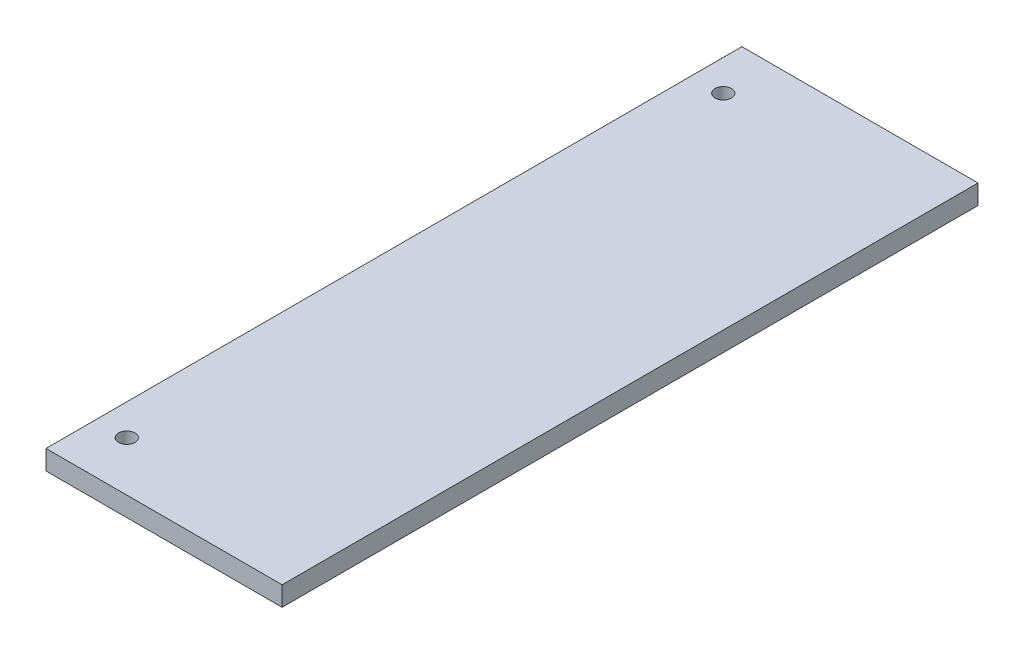
ISO-10303-21;
HEADER;
FILE_DESCRIPTION(('STEP AP214'),'2;1');
FILE_NAME('part.step','',(''),(''),'','','');
FILE_SCHEMA(('AUTOMOTIVE_DESIGN { 1 0 10303 214 1 1 1 1 }'));
ENDSEC;
DATA;
#1=APPLICATION_CONTEXT('core data for automotive mechanical design processes');
#2=APPLICATION_PROTOCOL_DEFINITION('international standard','automotive_design',2000,#1);
#3=PRODUCT_CONTEXT('',#1,'mechanical');
#4=PRODUCT('Part','Part','',(#3));
#5=PRODUCT_RELATED_PRODUCT_CATEGORY('part','',(#4));
#6=PRODUCT_DEFINITION_FORMATION('','',#4);
#7=PRODUCT_DEFINITION_CONTEXT('part definition',#1,'design');
#8=PRODUCT_DEFINITION('design','',#6,#7);
#9=PRODUCT_DEFINITION_SHAPE('','',#8);
#10=(LENGTH_UNIT() NAMED_UNIT(*) SI_UNIT(.MILLI.,.METRE.));
#11=(NAMED_UNIT(*) PLANE_ANGLE_UNIT() SI_UNIT($,.RADIAN.));
#12=(NAMED_UNIT(*) SI_UNIT($,.STERADIAN.) SOLID_ANGLE_UNIT());
#13=UNCERTAINTY_MEASURE_WITH_UNIT(LENGTH_MEASURE(1.E-05),#10,'distance_accuracy_value','');
#14=(GEOMETRIC_REPRESENTATION_CONTEXT(3) GLOBAL_UNCERTAINTY_ASSIGNED_CONTEXT((#13)) GLOBAL_UNIT_ASSIGNED_CONTEXT((#10,
#11,#12)) REPRESENTATION_CONTEXT('',''));
#15=CARTESIAN_POINT('',(0.,0.,0.));
#16=DIRECTION('',(0.,0.,1.));
#17=DIRECTION('',(1.,0.,0.));
#18=AXIS2_PLACEMENT_3D('',#15,#16,#17);
#19=CARTESIAN_POINT('',(15.08125,2.5,44.45));
#20=DIRECTION('',(-1.,0.,0.));
#21=DIRECTION('',(0.,0.,1.));
#22=AXIS2_PLACEMENT_3D('',#19,#20,#21);
#23=PLANE('',#22);
#24=DIRECTION('',(0.,0.,-1.));
#25=VECTOR('',#24,1.);
#26=CARTESIAN_POINT('',(15.08125,0.,44.45));
#27=LINE('',#26,#25);
#28=CARTESIAN_POINT('',(15.08125,0.,44.45));
#29=VERTEX_POINT('',#28);
#30=CARTESIAN_POINT('',(15.08125,0.,-44.45));
#31=VERTEX_POINT('',#30);
#32=EDGE_CURVE('E107',#29,#31,#27,.T.);
#33=ORIENTED_EDGE('',*,*,#32,.T.);
#34=DIRECTION('',(0.,-1.,0.));
#35=VECTOR('',#34,1.);
#36=CARTESIAN_POINT('',(15.08125,2.5,-44.45));
#37=LINE('',#36,#35);
#38=CARTESIAN_POINT('',(15.08125,2.5,-44.45));
#39=VERTEX_POINT('',#38);
#40=EDGE_CURVE('E11',#39,#31,#37,.T.);
#41=ORIENTED_EDGE('',*,*,#40,.F.);
#42=DIRECTION('',(0.,0.,-1.));
#43=VECTOR('',#42,1.);
#44=CARTESIAN_POINT('',(15.08125,2.5,44.45));
#45=LINE('',#44,#43);
#46=CARTESIAN_POINT('',(15.08125,2.5,44.45));
#47=VERTEX_POINT('',#46);
#48=EDGE_CURVE('E91',#47,#39,#45,.T.);
#49=ORIENTED_EDGE('',*,*,#48,.F.);
#50=DIRECTION('',(0.,-1.,0.));
#51=VECTOR('',#50,1.);
#52=CARTESIAN_POINT('',(15.08125,2.5,44.45));
#53=LINE('',#52,#51);
#54=EDGE_CURVE('E103',#47,#29,#53,.T.);
#55=ORIENTED_EDGE('',*,*,#54,.T.);
#56=EDGE_LOOP('',(#33,#41,#49,#55));
#57=FACE_BOUND('',#56,.T.);
#58=ADVANCED_FACE('F39',(#57),#23,.F.);
#59=CARTESIAN_POINT('',(-15.08125,2.5,-44.45));
#60=DIRECTION('',(0.,0.,1.));
#61=DIRECTION('',(1.,0.,0.));
#62=AXIS2_PLACEMENT_3D('',#59,#60,#61);
#63=PLANE('',#62);
#64=DIRECTION('',(-1.,0.,0.));
#65=VECTOR('',#64,1.);
#66=CARTESIAN_POINT('',(-15.08125,0.,-44.45));
#67=LINE('',#66,#65);
#68=CARTESIAN_POINT('',(-15.08125,0.,-44.45));
#69=VERTEX_POINT('',#68);
#70=EDGE_CURVE('E96',#31,#69,#67,.T.);
#71=ORIENTED_EDGE('',*,*,#70,.T.);
#72=DIRECTION('',(0.,-1.,0.));
#73=VECTOR('',#72,1.);
#74=CARTESIAN_POINT('',(-15.08125,2.5,-44.45));
#75=LINE('',#74,#73);
#76=CARTESIAN_POINT('',(-15.08125,2.5,-44.45));
#77=VERTEX_POINT('',#76);
#78=EDGE_CURVE('E48',#77,#69,#75,.T.);
#79=ORIENTED_EDGE('',*,*,#78,.F.);
#80=DIRECTION('',(-1.,0.,0.));
#81=VECTOR('',#80,1.);
#82=CARTESIAN_POINT('',(-15.08125,2.5,-44.45));
#83=LINE('',#82,#81);
#84=EDGE_CURVE('E86',#39,#77,#83,.T.);
#85=ORIENTED_EDGE('',*,*,#84,.F.);
#86=ORIENTED_EDGE('',*,*,#40,.T.);
#87=EDGE_LOOP('',(#71,#79,#85,#86));
#88=FACE_BOUND('',#87,.T.);
#89=ADVANCED_FACE('F95',(#88),#63,.F.);
#90=CARTESIAN_POINT('',(-15.08125,2.5,44.45));
#91=DIRECTION('',(1.,0.,0.));
#92=DIRECTION('',(0.,0.,-1.));
#93=AXIS2_PLACEMENT_3D('',#90,#91,#92);
#94=PLANE('',#93);
#95=DIRECTION('',(0.,0.,1.));
#96=VECTOR('',#95,1.);
#97=CARTESIAN_POINT('',(-15.08125,0.,44.45));
#98=LINE('',#97,#96);
#99=CARTESIAN_POINT('',(-15.08125,0.,44.45));
#100=VERTEX_POINT('',#99);
#101=EDGE_CURVE('E73',#69,#100,#98,.T.);
#102=ORIENTED_EDGE('',*,*,#101,.T.);
#103=DIRECTION('',(0.,-1.,0.));
#104=VECTOR('',#103,1.);
#105=CARTESIAN_POINT('',(-15.08125,2.5,44.45));
#106=LINE('',#105,#104);
#107=CARTESIAN_POINT('',(-15.08125,2.5,44.45));
#108=VERTEX_POINT('',#107);
#109=EDGE_CURVE('E98',#108,#100,#106,.T.);
#110=ORIENTED_EDGE('',*,*,#109,.F.);
#111=DIRECTION('',(0.,0.,1.));
#112=VECTOR('',#111,1.);
#113=CARTESIAN_POINT('',(-15.08125,2.5,44.45));
#114=LINE('',#113,#112);
#115=EDGE_CURVE('E89',#77,#108,#114,.T.);
#116=ORIENTED_EDGE('',*,*,#115,.F.);
#117=ORIENTED_EDGE('',*,*,#78,.T.);
#118=EDGE_LOOP('',(#102,#110,#116,#117));
#119=FACE_BOUND('',#118,.T.);
#120=ADVANCED_FACE('F99',(#119),#94,.F.);
#121=CARTESIAN_POINT('',(-15.08125,2.5,44.45));
#122=DIRECTION('',(0.,0.,-1.));
#123=DIRECTION('',(-1.,0.,0.));
#124=AXIS2_PLACEMENT_3D('',#121,#122,#123);
#125=PLANE('',#124);
#126=DIRECTION('',(1.,0.,0.));
#127=VECTOR('',#126,1.);
#128=CARTESIAN_POINT('',(-15.08125,0.,44.45));
#129=LINE('',#128,#127);
#130=EDGE_CURVE('E79',#100,#29,#129,.T.);
#131=ORIENTED_EDGE('',*,*,#130,.T.);
#132=ORIENTED_EDGE('',*,*,#54,.F.);
#133=DIRECTION('',(1.,0.,0.));
#134=VECTOR('',#133,1.);
#135=CARTESIAN_POINT('',(-15.08125,2.5,44.45));
#136=LINE('',#135,#134);
#137=EDGE_CURVE('E56',#108,#47,#136,.T.);
#138=ORIENTED_EDGE('',*,*,#137,.F.);
#139=ORIENTED_EDGE('',*,*,#109,.T.);
#140=EDGE_LOOP('',(#131,#132,#138,#139));
#141=FACE_BOUND('',#140,.T.);
#142=ADVANCED_FACE('F121',(#141),#125,.F.);
#143=CARTESIAN_POINT('',(0.,2.5,0.));
#144=DIRECTION('',(0.,-1.,0.));
#145=DIRECTION('',(0.,0.,-1.));
#146=AXIS2_PLACEMENT_3D('',#143,#144,#145);
#147=PLANE('',#146);
#148=CARTESIAN_POINT('',(-11.1125,2.5,-38.1));
#149=DIRECTION('',(0.,1.,0.));
#150=DIRECTION('',(0.,0.,1.));
#151=AXIS2_PLACEMENT_3D('',#148,#149,#150);
#152=CIRCLE('',#151,1.05);
#153=CARTESIAN_POINT('',(-11.1125,2.5,-37.05));
#154=VERTEX_POINT('',#153);
#155=EDGE_CURVE('E136',#154,#154,#152,.T.);
#156=ORIENTED_EDGE('',*,*,#155,.F.);
#157=EDGE_LOOP('',(#156));
#158=FACE_BOUND('',#157,.T.);
#159=CARTESIAN_POINT('',(-11.1125,2.5,38.1));
#160=DIRECTION('',(0.,1.,0.));
#161=DIRECTION('',(0.,0.,1.));
#162=AXIS2_PLACEMENT_3D('',#159,#160,#161);
#163=CIRCLE('',#162,1.05);
#164=CARTESIAN_POINT('',(-11.1125,2.5,39.15));
#165=VERTEX_POINT('',#164);
#166=EDGE_CURVE('E128',#165,#165,#163,.T.);
#167=ORIENTED_EDGE('',*,*,#166,.F.);
#168=EDGE_LOOP('',(#167));
#169=FACE_BOUND('',#168,.T.);
#170=ORIENTED_EDGE('',*,*,#48,.T.);
#171=ORIENTED_EDGE('',*,*,#84,.T.);
#172=ORIENTED_EDGE('',*,*,#115,.T.);
#173=ORIENTED_EDGE('',*,*,#137,.T.);
#174=EDGE_LOOP('',(#170,#171,#172,#173));
#175=FACE_BOUND('',#174,.T.);
#176=ADVANCED_FACE('F87',(#158,#169,#175),#147,.F.);
#177=CARTESIAN_POINT('',(0.,0.,0.));
#178=DIRECTION('',(0.,-1.,0.));
#179=DIRECTION('',(0.,0.,-1.));
#180=AXIS2_PLACEMENT_3D('',#177,#178,#179);
#181=PLANE('',#180);
#182=CARTESIAN_POINT('',(-11.1125,0.,-38.1));
#183=DIRECTION('',(0.,1.,0.));
#184=DIRECTION('',(0.,0.,1.));
#185=AXIS2_PLACEMENT_3D('',#182,#183,#184);
#186=CIRCLE('',#185,1.05);
#187=CARTESIAN_POINT('',(-11.1125,0.,-37.05));
#188=VERTEX_POINT('',#187);
#189=EDGE_CURVE('E111',#188,#188,#186,.T.);
#190=ORIENTED_EDGE('',*,*,#189,.T.);
#191=EDGE_LOOP('',(#190));
#192=FACE_BOUND('',#191,.T.);
#193=CARTESIAN_POINT('',(-11.1125,0.,38.1));
#194=DIRECTION('',(0.,1.,0.));
#195=DIRECTION('',(0.,0.,1.));
#196=AXIS2_PLACEMENT_3D('',#193,#194,#195);
#197=CIRCLE('',#196,1.05);
#198=CARTESIAN_POINT('',(-11.1125,0.,39.15));
#199=VERTEX_POINT('',#198);
#200=EDGE_CURVE('E132',#199,#199,#197,.T.);
#201=ORIENTED_EDGE('',*,*,#200,.T.);
#202=EDGE_LOOP('',(#201));
#203=FACE_BOUND('',#202,.T.);
#204=ORIENTED_EDGE('',*,*,#32,.F.);
#205=ORIENTED_EDGE('',*,*,#130,.F.);
#206=ORIENTED_EDGE('',*,*,#101,.F.);
#207=ORIENTED_EDGE('',*,*,#70,.F.);
#208=EDGE_LOOP('',(#204,#205,#206,#207));
#209=FACE_BOUND('',#208,.T.);
#210=ADVANCED_FACE('F124',(#192,#203,#209),#181,.T.);
#211=CARTESIAN_POINT('',(-11.1125,0.,38.1));
#212=DIRECTION('',(0.,1.,0.));
#213=DIRECTION('',(0.,0.,1.));
#214=AXIS2_PLACEMENT_3D('',#211,#212,#213);
#215=CYLINDRICAL_SURFACE('',#214,1.05);
#216=ORIENTED_EDGE('',*,*,#200,.F.);
#217=EDGE_LOOP('',(#216));
#218=FACE_BOUND('',#217,.T.);
#219=ORIENTED_EDGE('',*,*,#166,.T.);
#220=EDGE_LOOP('',(#219));
#221=FACE_BOUND('',#220,.T.);
#222=ADVANCED_FACE('F149',(#218,#221),#215,.F.);
#223=CARTESIAN_POINT('',(-11.1125,0.,-38.1));
#224=DIRECTION('',(0.,1.,0.));
#225=DIRECTION('',(0.,0.,1.));
#226=AXIS2_PLACEMENT_3D('',#223,#224,#225);
#227=CYLINDRICAL_SURFACE('',#226,1.05);
#228=ORIENTED_EDGE('',*,*,#189,.F.);
#229=EDGE_LOOP('',(#228));
#230=FACE_BOUND('',#229,.T.);
#231=ORIENTED_EDGE('',*,*,#155,.T.);
#232=EDGE_LOOP('',(#231));
#233=FACE_BOUND('',#232,.T.);
#234=ADVANCED_FACE('F146',(#230,#233),#227,.F.);
#235=CLOSED_SHELL('',(#58,#89,#120,#142,#176,#210,#222,#234));
#236=MANIFOLD_SOLID_BREP('B2',#235);
#237=ADVANCED_BREP_SHAPE_REPRESENTATION('',(#18,#236),#14);
#238=SHAPE_DEFINITION_REPRESENTATION(#9,#237);
ENDSEC;
END-ISO-10303-21;
